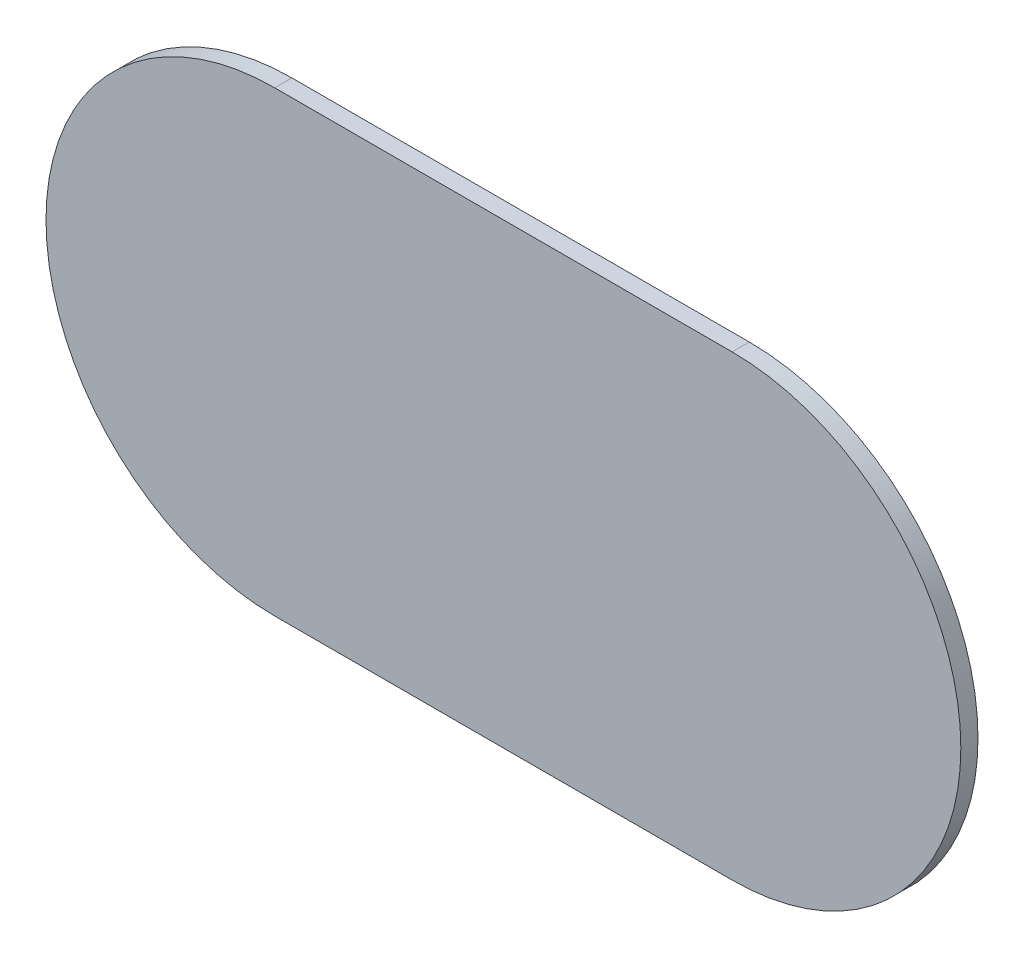
ISO-10303-21;
HEADER;
FILE_DESCRIPTION(('STEP AP214'),'2;1');
FILE_NAME('part.step','',(''),(''),'','','');
FILE_SCHEMA(('AUTOMOTIVE_DESIGN { 1 0 10303 214 1 1 1 1 }'));
ENDSEC;
DATA;
#1=APPLICATION_CONTEXT('core data for automotive mechanical design processes');
#2=APPLICATION_PROTOCOL_DEFINITION('international standard','automotive_design',2000,#1);
#3=PRODUCT_CONTEXT('',#1,'mechanical');
#4=PRODUCT('Part','Part','',(#3));
#5=PRODUCT_RELATED_PRODUCT_CATEGORY('part','',(#4));
#6=PRODUCT_DEFINITION_FORMATION('','',#4);
#7=PRODUCT_DEFINITION_CONTEXT('part definition',#1,'design');
#8=PRODUCT_DEFINITION('design','',#6,#7);
#9=PRODUCT_DEFINITION_SHAPE('','',#8);
#10=(LENGTH_UNIT() NAMED_UNIT(*) SI_UNIT(.MILLI.,.METRE.));
#11=(NAMED_UNIT(*) PLANE_ANGLE_UNIT() SI_UNIT($,.RADIAN.));
#12=(NAMED_UNIT(*) SI_UNIT($,.STERADIAN.) SOLID_ANGLE_UNIT());
#13=UNCERTAINTY_MEASURE_WITH_UNIT(LENGTH_MEASURE(1.E-05),#10,'distance_accuracy_value','');
#14=(GEOMETRIC_REPRESENTATION_CONTEXT(3) GLOBAL_UNCERTAINTY_ASSIGNED_CONTEXT((#13)) GLOBAL_UNIT_ASSIGNED_CONTEXT((#10,
#11,#12)) REPRESENTATION_CONTEXT('',''));
#15=CARTESIAN_POINT('',(0.,0.,0.));
#16=DIRECTION('',(0.,0.,1.));
#17=DIRECTION('',(1.,0.,0.));
#18=AXIS2_PLACEMENT_3D('',#15,#16,#17);
#19=CARTESIAN_POINT('',(-40.,0.,3.));
#20=DIRECTION('',(0.,0.,-1.));
#21=DIRECTION('',(-1.,0.,0.));
#22=AXIS2_PLACEMENT_3D('',#19,#20,#21);
#23=CYLINDRICAL_SURFACE('',#22,40.);
#24=CARTESIAN_POINT('',(-40.,0.,0.));
#25=DIRECTION('',(0.,0.,1.));
#26=DIRECTION('',(1.,0.,0.));
#27=AXIS2_PLACEMENT_3D('',#24,#25,#26);
#28=CIRCLE('',#27,40.);
#29=CARTESIAN_POINT('',(-40.,40.,0.));
#30=VERTEX_POINT('',#29);
#31=CARTESIAN_POINT('',(-40.,-40.,0.));
#32=VERTEX_POINT('',#31);
#33=EDGE_CURVE('E102',#30,#32,#28,.T.);
#34=ORIENTED_EDGE('',*,*,#33,.T.);
#35=DIRECTION('',(0.,0.,-1.));
#36=VECTOR('',#35,1.);
#37=CARTESIAN_POINT('',(-40.,-40.,3.));
#38=LINE('',#37,#36);
#39=CARTESIAN_POINT('',(-40.,-40.,3.));
#40=VERTEX_POINT('',#39);
#41=EDGE_CURVE('E11',#40,#32,#38,.T.);
#42=ORIENTED_EDGE('',*,*,#41,.F.);
#43=CARTESIAN_POINT('',(-40.,0.,3.));
#44=DIRECTION('',(0.,0.,1.));
#45=DIRECTION('',(1.,0.,0.));
#46=AXIS2_PLACEMENT_3D('',#43,#44,#45);
#47=CIRCLE('',#46,40.);
#48=CARTESIAN_POINT('',(-40.,40.,3.));
#49=VERTEX_POINT('',#48);
#50=EDGE_CURVE('E88',#49,#40,#47,.T.);
#51=ORIENTED_EDGE('',*,*,#50,.F.);
#52=DIRECTION('',(0.,0.,-1.));
#53=VECTOR('',#52,1.);
#54=CARTESIAN_POINT('',(-40.,40.,3.));
#55=LINE('',#54,#53);
#56=EDGE_CURVE('E55',#49,#30,#55,.T.);
#57=ORIENTED_EDGE('',*,*,#56,.T.);
#58=EDGE_LOOP('',(#34,#42,#51,#57));
#59=FACE_BOUND('',#58,.T.);
#60=ADVANCED_FACE('F39',(#59),#23,.T.);
#61=CARTESIAN_POINT('',(-40.,-40.,3.));
#62=DIRECTION('',(0.,1.,0.));
#63=DIRECTION('',(0.,0.,1.));
#64=AXIS2_PLACEMENT_3D('',#61,#62,#63);
#65=PLANE('',#64);
#66=DIRECTION('',(1.,0.,0.));
#67=VECTOR('',#66,1.);
#68=CARTESIAN_POINT('',(-40.,-40.,0.));
#69=LINE('',#68,#67);
#70=CARTESIAN_POINT('',(40.,-40.,0.));
#71=VERTEX_POINT('',#70);
#72=EDGE_CURVE('E93',#32,#71,#69,.T.);
#73=ORIENTED_EDGE('',*,*,#72,.T.);
#74=DIRECTION('',(0.,0.,-1.));
#75=VECTOR('',#74,1.);
#76=CARTESIAN_POINT('',(40.,-40.,3.));
#77=LINE('',#76,#75);
#78=CARTESIAN_POINT('',(40.,-40.,3.));
#79=VERTEX_POINT('',#78);
#80=EDGE_CURVE('E47',#79,#71,#77,.T.);
#81=ORIENTED_EDGE('',*,*,#80,.F.);
#82=DIRECTION('',(1.,0.,0.));
#83=VECTOR('',#82,1.);
#84=CARTESIAN_POINT('',(-40.,-40.,3.));
#85=LINE('',#84,#83);
#86=EDGE_CURVE('E81',#40,#79,#85,.T.);
#87=ORIENTED_EDGE('',*,*,#86,.F.);
#88=ORIENTED_EDGE('',*,*,#41,.T.);
#89=EDGE_LOOP('',(#73,#81,#87,#88));
#90=FACE_BOUND('',#89,.T.);
#91=ADVANCED_FACE('F92',(#90),#65,.F.);
#92=CARTESIAN_POINT('',(40.,0.,3.));
#93=DIRECTION('',(0.,0.,-1.));
#94=DIRECTION('',(-1.,0.,0.));
#95=AXIS2_PLACEMENT_3D('',#92,#93,#94);
#96=CYLINDRICAL_SURFACE('',#95,40.);
#97=CARTESIAN_POINT('',(40.,0.,0.));
#98=DIRECTION('',(0.,0.,1.));
#99=DIRECTION('',(1.,0.,0.));
#100=AXIS2_PLACEMENT_3D('',#97,#98,#99);
#101=CIRCLE('',#100,40.);
#102=CARTESIAN_POINT('',(40.,40.,0.));
#103=VERTEX_POINT('',#102);
#104=EDGE_CURVE('E105',#71,#103,#101,.T.);
#105=ORIENTED_EDGE('',*,*,#104,.T.);
#106=DIRECTION('',(0.,0.,-1.));
#107=VECTOR('',#106,1.);
#108=CARTESIAN_POINT('',(40.,40.,3.));
#109=LINE('',#108,#107);
#110=CARTESIAN_POINT('',(40.,40.,3.));
#111=VERTEX_POINT('',#110);
#112=EDGE_CURVE('E70',#111,#103,#109,.T.);
#113=ORIENTED_EDGE('',*,*,#112,.F.);
#114=CARTESIAN_POINT('',(40.,0.,3.));
#115=DIRECTION('',(0.,0.,1.));
#116=DIRECTION('',(1.,0.,0.));
#117=AXIS2_PLACEMENT_3D('',#114,#115,#116);
#118=CIRCLE('',#117,40.);
#119=EDGE_CURVE('E87',#79,#111,#118,.T.);
#120=ORIENTED_EDGE('',*,*,#119,.F.);
#121=ORIENTED_EDGE('',*,*,#80,.T.);
#122=EDGE_LOOP('',(#105,#113,#120,#121));
#123=FACE_BOUND('',#122,.T.);
#124=ADVANCED_FACE('F96',(#123),#96,.T.);
#125=CARTESIAN_POINT('',(-40.,40.,3.));
#126=DIRECTION('',(0.,1.,0.));
#127=DIRECTION('',(0.,0.,1.));
#128=AXIS2_PLACEMENT_3D('',#125,#126,#127);
#129=PLANE('',#128);
#130=DIRECTION('',(1.,0.,0.));
#131=VECTOR('',#130,1.);
#132=CARTESIAN_POINT('',(-40.,40.,0.));
#133=LINE('',#132,#131);
#134=EDGE_CURVE('E107',#30,#103,#133,.T.);
#135=ORIENTED_EDGE('',*,*,#134,.F.);
#136=ORIENTED_EDGE('',*,*,#56,.F.);
#137=DIRECTION('',(1.,0.,0.));
#138=VECTOR('',#137,1.);
#139=CARTESIAN_POINT('',(-40.,40.,3.));
#140=LINE('',#139,#138);
#141=EDGE_CURVE('E97',#49,#111,#140,.T.);
#142=ORIENTED_EDGE('',*,*,#141,.T.);
#143=ORIENTED_EDGE('',*,*,#112,.T.);
#144=EDGE_LOOP('',(#135,#136,#142,#143));
#145=FACE_BOUND('',#144,.T.);
#146=ADVANCED_FACE('F113',(#145),#129,.T.);
#147=CARTESIAN_POINT('',(-40.,0.,3.));
#148=DIRECTION('',(0.,0.,1.));
#149=DIRECTION('',(1.,0.,0.));
#150=AXIS2_PLACEMENT_3D('',#147,#148,#149);
#151=PLANE('',#150);
#152=ORIENTED_EDGE('',*,*,#50,.T.);
#153=ORIENTED_EDGE('',*,*,#86,.T.);
#154=ORIENTED_EDGE('',*,*,#119,.T.);
#155=ORIENTED_EDGE('',*,*,#141,.F.);
#156=EDGE_LOOP('',(#152,#153,#154,#155));
#157=FACE_BOUND('',#156,.T.);
#158=ADVANCED_FACE('F84',(#157),#151,.T.);
#159=CARTESIAN_POINT('',(-40.,0.,0.));
#160=DIRECTION('',(0.,0.,1.));
#161=DIRECTION('',(1.,0.,0.));
#162=AXIS2_PLACEMENT_3D('',#159,#160,#161);
#163=PLANE('',#162);
#164=ORIENTED_EDGE('',*,*,#33,.F.);
#165=ORIENTED_EDGE('',*,*,#134,.T.);
#166=ORIENTED_EDGE('',*,*,#104,.F.);
#167=ORIENTED_EDGE('',*,*,#72,.F.);
#168=EDGE_LOOP('',(#164,#165,#166,#167));
#169=FACE_BOUND('',#168,.T.);
#170=ADVANCED_FACE('F112',(#169),#163,.F.);
#171=CLOSED_SHELL('',(#60,#91,#124,#146,#158,#170));
#172=MANIFOLD_SOLID_BREP('B2',#171);
#173=ADVANCED_BREP_SHAPE_REPRESENTATION('',(#18,#172),#14);
#174=SHAPE_DEFINITION_REPRESENTATION(#9,#173);
ENDSEC;
END-ISO-10303-21;
